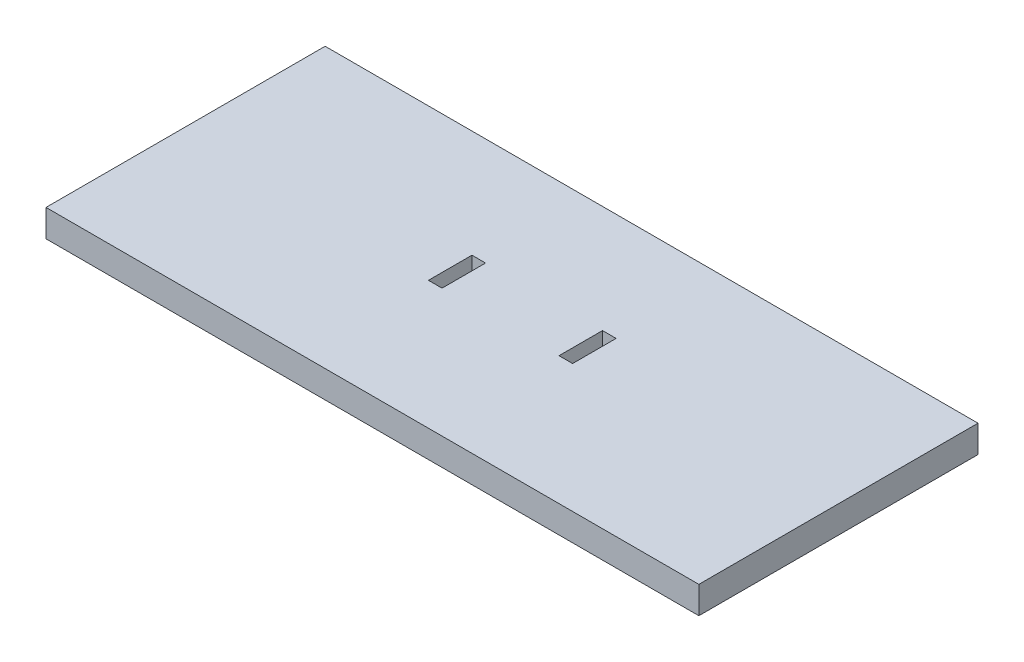
ISO-10303-21;
HEADER;
FILE_DESCRIPTION(('STEP AP214'),'2;1');
FILE_NAME('part.step','',(''),(''),'','','');
FILE_SCHEMA(('AUTOMOTIVE_DESIGN { 1 0 10303 214 1 1 1 1 }'));
ENDSEC;
DATA;
#1=APPLICATION_CONTEXT('core data for automotive mechanical design processes');
#2=APPLICATION_PROTOCOL_DEFINITION('international standard','automotive_design',2000,#1);
#3=PRODUCT_CONTEXT('',#1,'mechanical');
#4=PRODUCT('Part','Part','',(#3));
#5=PRODUCT_RELATED_PRODUCT_CATEGORY('part','',(#4));
#6=PRODUCT_DEFINITION_FORMATION('','',#4);
#7=PRODUCT_DEFINITION_CONTEXT('part definition',#1,'design');
#8=PRODUCT_DEFINITION('design','',#6,#7);
#9=PRODUCT_DEFINITION_SHAPE('','',#8);
#10=(LENGTH_UNIT() NAMED_UNIT(*) SI_UNIT(.MILLI.,.METRE.));
#11=(NAMED_UNIT(*) PLANE_ANGLE_UNIT() SI_UNIT($,.RADIAN.));
#12=(NAMED_UNIT(*) SI_UNIT($,.STERADIAN.) SOLID_ANGLE_UNIT());
#13=UNCERTAINTY_MEASURE_WITH_UNIT(LENGTH_MEASURE(1.E-05),#10,'distance_accuracy_value','');
#14=(GEOMETRIC_REPRESENTATION_CONTEXT(3) GLOBAL_UNCERTAINTY_ASSIGNED_CONTEXT((#13)) GLOBAL_UNIT_ASSIGNED_CONTEXT((#10,
#11,#12)) REPRESENTATION_CONTEXT('',''));
#15=CARTESIAN_POINT('',(0.,0.,0.));
#16=DIRECTION('',(0.,0.,1.));
#17=DIRECTION('',(1.,0.,0.));
#18=AXIS2_PLACEMENT_3D('',#15,#16,#17);
#19=CARTESIAN_POINT('',(0.,5.,0.));
#20=DIRECTION('',(0.,1.,0.));
#21=DIRECTION('',(0.,0.,1.));
#22=AXIS2_PLACEMENT_3D('',#19,#20,#21);
#23=PLANE('',#22);
#24=DIRECTION('',(0.,0.,-1.));
#25=VECTOR('',#24,1.);
#26=CARTESIAN_POINT('',(60.,5.,-25.6535));
#27=LINE('',#26,#25);
#28=CARTESIAN_POINT('',(60.,5.,25.6535));
#29=VERTEX_POINT('',#28);
#30=CARTESIAN_POINT('',(60.,5.,-25.6535));
#31=VERTEX_POINT('',#30);
#32=EDGE_CURVE('E192',#29,#31,#27,.T.);
#33=ORIENTED_EDGE('',*,*,#32,.T.);
#34=DIRECTION('',(-1.,0.,0.));
#35=VECTOR('',#34,1.);
#36=CARTESIAN_POINT('',(-60.,5.,-25.6535));
#37=LINE('',#36,#35);
#38=CARTESIAN_POINT('',(-60.,5.,-25.6535));
#39=VERTEX_POINT('',#38);
#40=EDGE_CURVE('E195',#31,#39,#37,.T.);
#41=ORIENTED_EDGE('',*,*,#40,.T.);
#42=DIRECTION('',(0.,0.,1.));
#43=VECTOR('',#42,1.);
#44=CARTESIAN_POINT('',(-60.,5.,-25.6535));
#45=LINE('',#44,#43);
#46=CARTESIAN_POINT('',(-60.,5.,25.6535));
#47=VERTEX_POINT('',#46);
#48=EDGE_CURVE('E198',#39,#47,#45,.T.);
#49=ORIENTED_EDGE('',*,*,#48,.T.);
#50=DIRECTION('',(1.,0.,0.));
#51=VECTOR('',#50,1.);
#52=CARTESIAN_POINT('',(-60.,5.,25.6535));
#53=LINE('',#52,#51);
#54=EDGE_CURVE('E200',#47,#29,#53,.T.);
#55=ORIENTED_EDGE('',*,*,#54,.T.);
#56=EDGE_LOOP('',(#33,#41,#49,#55));
#57=FACE_BOUND('',#56,.T.);
#58=DIRECTION('',(-1.,0.,0.));
#59=VECTOR('',#58,1.);
#60=CARTESIAN_POINT('',(-13.25,5.,-5.88834381093911));
#61=LINE('',#60,#59);
#62=CARTESIAN_POINT('',(-10.75,5.,-5.88834381093911));
#63=VERTEX_POINT('',#62);
#64=CARTESIAN_POINT('',(-13.25,5.,-5.88834381093911));
#65=VERTEX_POINT('',#64);
#66=EDGE_CURVE('E163',#63,#65,#61,.T.);
#67=ORIENTED_EDGE('',*,*,#66,.F.);
#68=DIRECTION('',(0.,0.,-1.));
#69=VECTOR('',#68,1.);
#70=CARTESIAN_POINT('',(-10.75,5.,-5.88834381093911));
#71=LINE('',#70,#69);
#72=CARTESIAN_POINT('',(-10.75,5.,2.11165618906089));
#73=VERTEX_POINT('',#72);
#74=EDGE_CURVE('E161',#73,#63,#71,.T.);
#75=ORIENTED_EDGE('',*,*,#74,.F.);
#76=DIRECTION('',(1.,0.,0.));
#77=VECTOR('',#76,1.);
#78=CARTESIAN_POINT('',(-13.25,5.,2.11165618906089));
#79=LINE('',#78,#77);
#80=CARTESIAN_POINT('',(-13.25,5.,2.11165618906089));
#81=VERTEX_POINT('',#80);
#82=EDGE_CURVE('E169',#81,#73,#79,.T.);
#83=ORIENTED_EDGE('',*,*,#82,.F.);
#84=DIRECTION('',(0.,0.,1.));
#85=VECTOR('',#84,1.);
#86=CARTESIAN_POINT('',(-13.25,5.,-5.88834381093911));
#87=LINE('',#86,#85);
#88=EDGE_CURVE('E166',#65,#81,#87,.T.);
#89=ORIENTED_EDGE('',*,*,#88,.F.);
#90=EDGE_LOOP('',(#67,#75,#83,#89));
#91=FACE_BOUND('',#90,.T.);
#92=DIRECTION('',(-1.,0.,0.));
#93=VECTOR('',#92,1.);
#94=CARTESIAN_POINT('',(13.25,5.,-5.88834381093912));
#95=LINE('',#94,#93);
#96=CARTESIAN_POINT('',(13.25,5.,-5.88834381093912));
#97=VERTEX_POINT('',#96);
#98=CARTESIAN_POINT('',(10.75,5.,-5.88834381093912));
#99=VERTEX_POINT('',#98);
#100=EDGE_CURVE('E133',#97,#99,#95,.T.);
#101=ORIENTED_EDGE('',*,*,#100,.F.);
#102=DIRECTION('',(0.,0.,-1.));
#103=VECTOR('',#102,1.);
#104=CARTESIAN_POINT('',(13.25,5.,-5.88834381093912));
#105=LINE('',#104,#103);
#106=CARTESIAN_POINT('',(13.25,5.,2.11165618906087));
#107=VERTEX_POINT('',#106);
#108=EDGE_CURVE('E125',#107,#97,#105,.T.);
#109=ORIENTED_EDGE('',*,*,#108,.F.);
#110=DIRECTION('',(1.,0.,0.));
#111=VECTOR('',#110,1.);
#112=CARTESIAN_POINT('',(13.25,5.,2.11165618906087));
#113=LINE('',#112,#111);
#114=CARTESIAN_POINT('',(10.75,5.,2.11165618906087));
#115=VERTEX_POINT('',#114);
#116=EDGE_CURVE('E147',#115,#107,#113,.T.);
#117=ORIENTED_EDGE('',*,*,#116,.F.);
#118=DIRECTION('',(0.,0.,1.));
#119=VECTOR('',#118,1.);
#120=CARTESIAN_POINT('',(10.75,5.,-5.88834381093912));
#121=LINE('',#120,#119);
#122=EDGE_CURVE('E145',#99,#115,#121,.T.);
#123=ORIENTED_EDGE('',*,*,#122,.F.);
#124=EDGE_LOOP('',(#101,#109,#117,#123));
#125=FACE_BOUND('',#124,.T.);
#126=ADVANCED_FACE('F36',(#57,#91,#125),#23,.T.);
#127=CARTESIAN_POINT('',(0.,0.,0.));
#128=DIRECTION('',(0.,1.,0.));
#129=DIRECTION('',(0.,0.,1.));
#130=AXIS2_PLACEMENT_3D('',#127,#128,#129);
#131=PLANE('',#130);
#132=DIRECTION('',(0.,0.,-1.));
#133=VECTOR('',#132,1.);
#134=CARTESIAN_POINT('',(-10.75,0.,-5.88834381093911));
#135=LINE('',#134,#133);
#136=CARTESIAN_POINT('',(-10.75,0.,2.11165618906089));
#137=VERTEX_POINT('',#136);
#138=CARTESIAN_POINT('',(-10.75,0.,-5.88834381093911));
#139=VERTEX_POINT('',#138);
#140=EDGE_CURVE('E141',#137,#139,#135,.T.);
#141=ORIENTED_EDGE('',*,*,#140,.T.);
#142=DIRECTION('',(-1.,0.,0.));
#143=VECTOR('',#142,1.);
#144=CARTESIAN_POINT('',(-13.25,0.,-5.88834381093911));
#145=LINE('',#144,#143);
#146=CARTESIAN_POINT('',(-13.25,0.,-5.88834381093911));
#147=VERTEX_POINT('',#146);
#148=EDGE_CURVE('E174',#139,#147,#145,.T.);
#149=ORIENTED_EDGE('',*,*,#148,.T.);
#150=DIRECTION('',(0.,0.,1.));
#151=VECTOR('',#150,1.);
#152=CARTESIAN_POINT('',(-13.25,0.,-5.88834381093911));
#153=LINE('',#152,#151);
#154=CARTESIAN_POINT('',(-13.25,0.,2.11165618906089));
#155=VERTEX_POINT('',#154);
#156=EDGE_CURVE('E177',#147,#155,#153,.T.);
#157=ORIENTED_EDGE('',*,*,#156,.T.);
#158=DIRECTION('',(1.,0.,0.));
#159=VECTOR('',#158,1.);
#160=CARTESIAN_POINT('',(-13.25,0.,2.11165618906089));
#161=LINE('',#160,#159);
#162=EDGE_CURVE('E164',#155,#137,#161,.T.);
#163=ORIENTED_EDGE('',*,*,#162,.T.);
#164=EDGE_LOOP('',(#141,#149,#157,#163));
#165=FACE_BOUND('',#164,.T.);
#166=DIRECTION('',(0.,0.,-1.));
#167=VECTOR('',#166,1.);
#168=CARTESIAN_POINT('',(60.,0.,-25.6535));
#169=LINE('',#168,#167);
#170=CARTESIAN_POINT('',(60.,0.,25.6535));
#171=VERTEX_POINT('',#170);
#172=CARTESIAN_POINT('',(60.,0.,-25.6535));
#173=VERTEX_POINT('',#172);
#174=EDGE_CURVE('E191',#171,#173,#169,.T.);
#175=ORIENTED_EDGE('',*,*,#174,.F.);
#176=DIRECTION('',(1.,0.,0.));
#177=VECTOR('',#176,1.);
#178=CARTESIAN_POINT('',(-60.,0.,25.6535));
#179=LINE('',#178,#177);
#180=CARTESIAN_POINT('',(-60.,0.,25.6535));
#181=VERTEX_POINT('',#180);
#182=EDGE_CURVE('E196',#181,#171,#179,.T.);
#183=ORIENTED_EDGE('',*,*,#182,.F.);
#184=DIRECTION('',(0.,0.,1.));
#185=VECTOR('',#184,1.);
#186=CARTESIAN_POINT('',(-60.,0.,-25.6535));
#187=LINE('',#186,#185);
#188=CARTESIAN_POINT('',(-60.,0.,-25.6535));
#189=VERTEX_POINT('',#188);
#190=EDGE_CURVE('E207',#189,#181,#187,.T.);
#191=ORIENTED_EDGE('',*,*,#190,.F.);
#192=DIRECTION('',(-1.,0.,0.));
#193=VECTOR('',#192,1.);
#194=CARTESIAN_POINT('',(-60.,0.,-25.6535));
#195=LINE('',#194,#193);
#196=EDGE_CURVE('E205',#173,#189,#195,.T.);
#197=ORIENTED_EDGE('',*,*,#196,.F.);
#198=EDGE_LOOP('',(#175,#183,#191,#197));
#199=FACE_BOUND('',#198,.T.);
#200=DIRECTION('',(0.,0.,-1.));
#201=VECTOR('',#200,1.);
#202=CARTESIAN_POINT('',(13.25,0.,-5.88834381093912));
#203=LINE('',#202,#201);
#204=CARTESIAN_POINT('',(13.25,0.,2.11165618906087));
#205=VERTEX_POINT('',#204);
#206=CARTESIAN_POINT('',(13.25,0.,-5.88834381093912));
#207=VERTEX_POINT('',#206);
#208=EDGE_CURVE('E59',#205,#207,#203,.T.);
#209=ORIENTED_EDGE('',*,*,#208,.T.);
#210=DIRECTION('',(-1.,0.,0.));
#211=VECTOR('',#210,1.);
#212=CARTESIAN_POINT('',(13.25,0.,-5.88834381093912));
#213=LINE('',#212,#211);
#214=CARTESIAN_POINT('',(10.75,0.,-5.88834381093912));
#215=VERTEX_POINT('',#214);
#216=EDGE_CURVE('E140',#207,#215,#213,.T.);
#217=ORIENTED_EDGE('',*,*,#216,.T.);
#218=DIRECTION('',(0.,0.,1.));
#219=VECTOR('',#218,1.);
#220=CARTESIAN_POINT('',(10.75,0.,-5.88834381093912));
#221=LINE('',#220,#219);
#222=CARTESIAN_POINT('',(10.75,0.,2.11165618906087));
#223=VERTEX_POINT('',#222);
#224=EDGE_CURVE('E153',#215,#223,#221,.T.);
#225=ORIENTED_EDGE('',*,*,#224,.T.);
#226=DIRECTION('',(1.,0.,0.));
#227=VECTOR('',#226,1.);
#228=CARTESIAN_POINT('',(13.25,0.,2.11165618906087));
#229=LINE('',#228,#227);
#230=EDGE_CURVE('E134',#223,#205,#229,.T.);
#231=ORIENTED_EDGE('',*,*,#230,.T.);
#232=EDGE_LOOP('',(#209,#217,#225,#231));
#233=FACE_BOUND('',#232,.T.);
#234=ADVANCED_FACE('F225',(#165,#199,#233),#131,.F.);
#235=CARTESIAN_POINT('',(60.,5.,-25.6535));
#236=DIRECTION('',(-1.,0.,0.));
#237=DIRECTION('',(0.,0.,1.));
#238=AXIS2_PLACEMENT_3D('',#235,#236,#237);
#239=PLANE('',#238);
#240=ORIENTED_EDGE('',*,*,#174,.T.);
#241=DIRECTION('',(0.,-1.,0.));
#242=VECTOR('',#241,1.);
#243=CARTESIAN_POINT('',(60.,5.,-25.6535));
#244=LINE('',#243,#242);
#245=EDGE_CURVE('E11',#31,#173,#244,.T.);
#246=ORIENTED_EDGE('',*,*,#245,.F.);
#247=ORIENTED_EDGE('',*,*,#32,.F.);
#248=DIRECTION('',(0.,-1.,0.));
#249=VECTOR('',#248,1.);
#250=CARTESIAN_POINT('',(60.,5.,25.6535));
#251=LINE('',#250,#249);
#252=EDGE_CURVE('E202',#29,#171,#251,.T.);
#253=ORIENTED_EDGE('',*,*,#252,.T.);
#254=EDGE_LOOP('',(#240,#246,#247,#253));
#255=FACE_BOUND('',#254,.T.);
#256=ADVANCED_FACE('F38',(#255),#239,.F.);
#257=CARTESIAN_POINT('',(-60.,5.,-25.6535));
#258=DIRECTION('',(0.,0.,1.));
#259=DIRECTION('',(1.,0.,0.));
#260=AXIS2_PLACEMENT_3D('',#257,#258,#259);
#261=PLANE('',#260);
#262=ORIENTED_EDGE('',*,*,#196,.T.);
#263=DIRECTION('',(0.,-1.,0.));
#264=VECTOR('',#263,1.);
#265=CARTESIAN_POINT('',(-60.,5.,-25.6535));
#266=LINE('',#265,#264);
#267=EDGE_CURVE('E44',#39,#189,#266,.T.);
#268=ORIENTED_EDGE('',*,*,#267,.F.);
#269=ORIENTED_EDGE('',*,*,#40,.F.);
#270=ORIENTED_EDGE('',*,*,#245,.T.);
#271=EDGE_LOOP('',(#262,#268,#269,#270));
#272=FACE_BOUND('',#271,.T.);
#273=ADVANCED_FACE('F236',(#272),#261,.F.);
#274=CARTESIAN_POINT('',(-60.,5.,-25.6535));
#275=DIRECTION('',(1.,0.,0.));
#276=DIRECTION('',(0.,0.,-1.));
#277=AXIS2_PLACEMENT_3D('',#274,#275,#276);
#278=PLANE('',#277);
#279=ORIENTED_EDGE('',*,*,#190,.T.);
#280=DIRECTION('',(0.,-1.,0.));
#281=VECTOR('',#280,1.);
#282=CARTESIAN_POINT('',(-60.,5.,25.6535));
#283=LINE('',#282,#281);
#284=EDGE_CURVE('E212',#47,#181,#283,.T.);
#285=ORIENTED_EDGE('',*,*,#284,.F.);
#286=ORIENTED_EDGE('',*,*,#48,.F.);
#287=ORIENTED_EDGE('',*,*,#267,.T.);
#288=EDGE_LOOP('',(#279,#285,#286,#287));
#289=FACE_BOUND('',#288,.T.);
#290=ADVANCED_FACE('F219',(#289),#278,.F.);
#291=CARTESIAN_POINT('',(-60.,5.,25.6535));
#292=DIRECTION('',(0.,0.,-1.));
#293=DIRECTION('',(-1.,0.,0.));
#294=AXIS2_PLACEMENT_3D('',#291,#292,#293);
#295=PLANE('',#294);
#296=ORIENTED_EDGE('',*,*,#182,.T.);
#297=ORIENTED_EDGE('',*,*,#252,.F.);
#298=ORIENTED_EDGE('',*,*,#54,.F.);
#299=ORIENTED_EDGE('',*,*,#284,.T.);
#300=EDGE_LOOP('',(#296,#297,#298,#299));
#301=FACE_BOUND('',#300,.T.);
#302=ADVANCED_FACE('F229',(#301),#295,.F.);
#303=CARTESIAN_POINT('',(-10.75,5.,-5.88834381093911));
#304=DIRECTION('',(-1.,0.,0.));
#305=DIRECTION('',(0.,0.,1.));
#306=AXIS2_PLACEMENT_3D('',#303,#304,#305);
#307=PLANE('',#306);
#308=ORIENTED_EDGE('',*,*,#140,.F.);
#309=DIRECTION('',(0.,-1.,0.));
#310=VECTOR('',#309,1.);
#311=CARTESIAN_POINT('',(-10.75,5.,2.11165618906089));
#312=LINE('',#311,#310);
#313=EDGE_CURVE('E171',#73,#137,#312,.T.);
#314=ORIENTED_EDGE('',*,*,#313,.F.);
#315=ORIENTED_EDGE('',*,*,#74,.T.);
#316=DIRECTION('',(0.,-1.,0.));
#317=VECTOR('',#316,1.);
#318=CARTESIAN_POINT('',(-10.75,5.,-5.88834381093911));
#319=LINE('',#318,#317);
#320=EDGE_CURVE('E188',#63,#139,#319,.T.);
#321=ORIENTED_EDGE('',*,*,#320,.T.);
#322=EDGE_LOOP('',(#308,#314,#315,#321));
#323=FACE_BOUND('',#322,.T.);
#324=ADVANCED_FACE('F251',(#323),#307,.T.);
#325=CARTESIAN_POINT('',(-13.25,5.,-5.88834381093911));
#326=DIRECTION('',(0.,0.,1.));
#327=DIRECTION('',(1.,0.,0.));
#328=AXIS2_PLACEMENT_3D('',#325,#326,#327);
#329=PLANE('',#328);
#330=ORIENTED_EDGE('',*,*,#148,.F.);
#331=ORIENTED_EDGE('',*,*,#320,.F.);
#332=ORIENTED_EDGE('',*,*,#66,.T.);
#333=DIRECTION('',(0.,-1.,0.));
#334=VECTOR('',#333,1.);
#335=CARTESIAN_POINT('',(-13.25,5.,-5.88834381093911));
#336=LINE('',#335,#334);
#337=EDGE_CURVE('E186',#65,#147,#336,.T.);
#338=ORIENTED_EDGE('',*,*,#337,.T.);
#339=EDGE_LOOP('',(#330,#331,#332,#338));
#340=FACE_BOUND('',#339,.T.);
#341=ADVANCED_FACE('F258',(#340),#329,.T.);
#342=CARTESIAN_POINT('',(-13.25,5.,-5.88834381093911));
#343=DIRECTION('',(1.,0.,0.));
#344=DIRECTION('',(0.,0.,-1.));
#345=AXIS2_PLACEMENT_3D('',#342,#343,#344);
#346=PLANE('',#345);
#347=ORIENTED_EDGE('',*,*,#156,.F.);
#348=ORIENTED_EDGE('',*,*,#337,.F.);
#349=ORIENTED_EDGE('',*,*,#88,.T.);
#350=DIRECTION('',(0.,-1.,0.));
#351=VECTOR('',#350,1.);
#352=CARTESIAN_POINT('',(-13.25,5.,2.11165618906089));
#353=LINE('',#352,#351);
#354=EDGE_CURVE('E184',#81,#155,#353,.T.);
#355=ORIENTED_EDGE('',*,*,#354,.T.);
#356=EDGE_LOOP('',(#347,#348,#349,#355));
#357=FACE_BOUND('',#356,.T.);
#358=ADVANCED_FACE('F263',(#357),#346,.T.);
#359=CARTESIAN_POINT('',(-13.25,5.,2.11165618906089));
#360=DIRECTION('',(0.,0.,-1.));
#361=DIRECTION('',(-1.,0.,0.));
#362=AXIS2_PLACEMENT_3D('',#359,#360,#361);
#363=PLANE('',#362);
#364=ORIENTED_EDGE('',*,*,#162,.F.);
#365=ORIENTED_EDGE('',*,*,#354,.F.);
#366=ORIENTED_EDGE('',*,*,#82,.T.);
#367=ORIENTED_EDGE('',*,*,#313,.T.);
#368=EDGE_LOOP('',(#364,#365,#366,#367));
#369=FACE_BOUND('',#368,.T.);
#370=ADVANCED_FACE('F270',(#369),#363,.T.);
#371=CARTESIAN_POINT('',(13.25,5.,-5.88834381093912));
#372=DIRECTION('',(-1.,0.,0.));
#373=DIRECTION('',(0.,0.,1.));
#374=AXIS2_PLACEMENT_3D('',#371,#372,#373);
#375=PLANE('',#374);
#376=ORIENTED_EDGE('',*,*,#208,.F.);
#377=DIRECTION('',(0.,-1.,0.));
#378=VECTOR('',#377,1.);
#379=CARTESIAN_POINT('',(13.25,5.,2.11165618906087));
#380=LINE('',#379,#378);
#381=EDGE_CURVE('E129',#107,#205,#380,.T.);
#382=ORIENTED_EDGE('',*,*,#381,.F.);
#383=ORIENTED_EDGE('',*,*,#108,.T.);
#384=DIRECTION('',(0.,-1.,0.));
#385=VECTOR('',#384,1.);
#386=CARTESIAN_POINT('',(13.25,5.,-5.88834381093912));
#387=LINE('',#386,#385);
#388=EDGE_CURVE('E128',#97,#207,#387,.T.);
#389=ORIENTED_EDGE('',*,*,#388,.T.);
#390=EDGE_LOOP('',(#376,#382,#383,#389));
#391=FACE_BOUND('',#390,.T.);
#392=ADVANCED_FACE('F127',(#391),#375,.T.);
#393=CARTESIAN_POINT('',(13.25,5.,-5.88834381093912));
#394=DIRECTION('',(0.,0.,1.));
#395=DIRECTION('',(1.,0.,0.));
#396=AXIS2_PLACEMENT_3D('',#393,#394,#395);
#397=PLANE('',#396);
#398=ORIENTED_EDGE('',*,*,#216,.F.);
#399=ORIENTED_EDGE('',*,*,#388,.F.);
#400=ORIENTED_EDGE('',*,*,#100,.T.);
#401=DIRECTION('',(0.,-1.,0.));
#402=VECTOR('',#401,1.);
#403=CARTESIAN_POINT('',(10.75,5.,-5.88834381093912));
#404=LINE('',#403,#402);
#405=EDGE_CURVE('E142',#99,#215,#404,.T.);
#406=ORIENTED_EDGE('',*,*,#405,.T.);
#407=EDGE_LOOP('',(#398,#399,#400,#406));
#408=FACE_BOUND('',#407,.T.);
#409=ADVANCED_FACE('F137',(#408),#397,.T.);
#410=CARTESIAN_POINT('',(10.75,5.,-5.88834381093912));
#411=DIRECTION('',(1.,0.,0.));
#412=DIRECTION('',(0.,0.,-1.));
#413=AXIS2_PLACEMENT_3D('',#410,#411,#412);
#414=PLANE('',#413);
#415=ORIENTED_EDGE('',*,*,#224,.F.);
#416=ORIENTED_EDGE('',*,*,#405,.F.);
#417=ORIENTED_EDGE('',*,*,#122,.T.);
#418=DIRECTION('',(0.,-1.,0.));
#419=VECTOR('',#418,1.);
#420=CARTESIAN_POINT('',(10.75,5.,2.11165618906087));
#421=LINE('',#420,#419);
#422=EDGE_CURVE('E51',#115,#223,#421,.T.);
#423=ORIENTED_EDGE('',*,*,#422,.T.);
#424=EDGE_LOOP('',(#415,#416,#417,#423));
#425=FACE_BOUND('',#424,.T.);
#426=ADVANCED_FACE('F288',(#425),#414,.T.);
#427=CARTESIAN_POINT('',(13.25,5.,2.11165618906087));
#428=DIRECTION('',(0.,0.,-1.));
#429=DIRECTION('',(-1.,0.,0.));
#430=AXIS2_PLACEMENT_3D('',#427,#428,#429);
#431=PLANE('',#430);
#432=ORIENTED_EDGE('',*,*,#230,.F.);
#433=ORIENTED_EDGE('',*,*,#422,.F.);
#434=ORIENTED_EDGE('',*,*,#116,.T.);
#435=ORIENTED_EDGE('',*,*,#381,.T.);
#436=EDGE_LOOP('',(#432,#433,#434,#435));
#437=FACE_BOUND('',#436,.T.);
#438=ADVANCED_FACE('F291',(#437),#431,.T.);
#439=CLOSED_SHELL('',(#126,#234,#256,#273,#290,#302,#324,#341,#358,#370,#392,#409,#426,#438));
#440=MANIFOLD_SOLID_BREP('B2',#439);
#441=ADVANCED_BREP_SHAPE_REPRESENTATION('',(#18,#440),#14);
#442=SHAPE_DEFINITION_REPRESENTATION(#9,#441);
ENDSEC;
END-ISO-10303-21;
